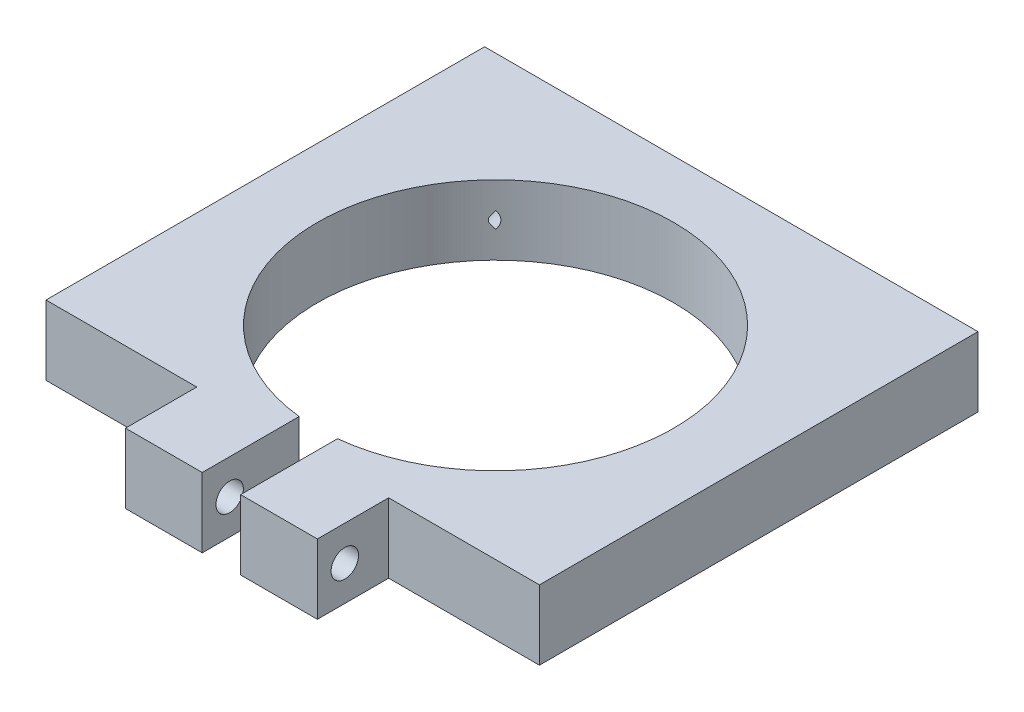
ISO-10303-21;
HEADER;
FILE_DESCRIPTION(('STEP AP214'),'2;1');
FILE_NAME('part.step','',(''),(''),'','','');
FILE_SCHEMA(('AUTOMOTIVE_DESIGN { 1 0 10303 214 1 1 1 1 }'));
ENDSEC;
DATA;
#1=APPLICATION_CONTEXT('core data for automotive mechanical design processes');
#2=APPLICATION_PROTOCOL_DEFINITION('international standard','automotive_design',2000,#1);
#3=PRODUCT_CONTEXT('',#1,'mechanical');
#4=PRODUCT('Part','Part','',(#3));
#5=PRODUCT_RELATED_PRODUCT_CATEGORY('part','',(#4));
#6=PRODUCT_DEFINITION_FORMATION('','',#4);
#7=PRODUCT_DEFINITION_CONTEXT('part definition',#1,'design');
#8=PRODUCT_DEFINITION('design','',#6,#7);
#9=PRODUCT_DEFINITION_SHAPE('','',#8);
#10=(LENGTH_UNIT() NAMED_UNIT(*) SI_UNIT(.MILLI.,.METRE.));
#11=(NAMED_UNIT(*) PLANE_ANGLE_UNIT() SI_UNIT($,.RADIAN.));
#12=(NAMED_UNIT(*) SI_UNIT($,.STERADIAN.) SOLID_ANGLE_UNIT());
#13=UNCERTAINTY_MEASURE_WITH_UNIT(LENGTH_MEASURE(1.E-05),#10,'distance_accuracy_value','');
#14=(GEOMETRIC_REPRESENTATION_CONTEXT(3) GLOBAL_UNCERTAINTY_ASSIGNED_CONTEXT((#13)) GLOBAL_UNIT_ASSIGNED_CONTEXT((#10,
#11,#12)) REPRESENTATION_CONTEXT('',''));
#15=CARTESIAN_POINT('',(0.,0.,0.));
#16=DIRECTION('',(0.,0.,1.));
#17=DIRECTION('',(1.,0.,0.));
#18=AXIS2_PLACEMENT_3D('',#15,#16,#17);
#19=CARTESIAN_POINT('',(-45.,12.7,46.5));
#20=DIRECTION('',(0.,0.,-1.));
#21=DIRECTION('',(-1.,0.,0.));
#22=AXIS2_PLACEMENT_3D('',#19,#20,#21);
#23=PLANE('',#22);
#24=DIRECTION('',(1.,0.,0.));
#25=VECTOR('',#24,1.);
#26=CARTESIAN_POINT('',(-45.,12.7,46.5));
#27=LINE('',#26,#25);
#28=CARTESIAN_POINT('',(3.50000000000001,12.7,46.5));
#29=VERTEX_POINT('',#28);
#30=CARTESIAN_POINT('',(17.5,12.7,46.5));
#31=VERTEX_POINT('',#30);
#32=EDGE_CURVE('E258',#29,#31,#27,.T.);
#33=ORIENTED_EDGE('',*,*,#32,.F.);
#34=DIRECTION('',(0.,1.,0.));
#35=VECTOR('',#34,1.);
#36=CARTESIAN_POINT('',(3.50000000000001,-0.000999999999999265,46.5));
#37=LINE('',#36,#35);
#38=CARTESIAN_POINT('',(3.50000000000001,0.,46.5));
#39=VERTEX_POINT('',#38);
#40=EDGE_CURVE('E200',#39,#29,#37,.T.);
#41=ORIENTED_EDGE('',*,*,#40,.F.);
#42=DIRECTION('',(1.,0.,0.));
#43=VECTOR('',#42,1.);
#44=CARTESIAN_POINT('',(-45.,0.,46.5));
#45=LINE('',#44,#43);
#46=CARTESIAN_POINT('',(17.5,0.,46.5));
#47=VERTEX_POINT('',#46);
#48=EDGE_CURVE('E271',#39,#47,#45,.T.);
#49=ORIENTED_EDGE('',*,*,#48,.T.);
#50=DIRECTION('',(0.,1.,0.));
#51=VECTOR('',#50,1.);
#52=CARTESIAN_POINT('',(17.5,-0.000999999999999265,46.5));
#53=LINE('',#52,#51);
#54=EDGE_CURVE('E235',#47,#31,#53,.T.);
#55=ORIENTED_EDGE('',*,*,#54,.T.);
#56=EDGE_LOOP('',(#33,#41,#49,#55));
#57=FACE_BOUND('',#56,.T.);
#58=ADVANCED_FACE('F33',(#57),#23,.F.);
#59=CARTESIAN_POINT('',(-45.,12.7,-46.5));
#60=DIRECTION('',(0.,0.,-1.));
#61=DIRECTION('',(-1.,0.,0.));
#62=AXIS2_PLACEMENT_3D('',#59,#60,#61);
#63=PLANE('',#62);
#64=CARTESIAN_POINT('',(40.,6.35,-46.5));
#65=DIRECTION('',(0.,0.,-1.));
#66=DIRECTION('',(-1.,0.,0.));
#67=AXIS2_PLACEMENT_3D('',#64,#65,#66);
#68=CIRCLE('',#67,2.5);
#69=CARTESIAN_POINT('',(37.5,6.35,-46.5));
#70=VERTEX_POINT('',#69);
#71=EDGE_CURVE('E160',#70,#70,#68,.T.);
#72=ORIENTED_EDGE('',*,*,#71,.F.);
#73=EDGE_LOOP('',(#72));
#74=FACE_BOUND('',#73,.T.);
#75=CARTESIAN_POINT('',(25.,6.35,-46.5));
#76=DIRECTION('',(0.,0.,-1.));
#77=DIRECTION('',(-1.,0.,0.));
#78=AXIS2_PLACEMENT_3D('',#75,#76,#77);
#79=CIRCLE('',#78,2.5);
#80=CARTESIAN_POINT('',(22.5,6.35,-46.5));
#81=VERTEX_POINT('',#80);
#82=EDGE_CURVE('E159',#81,#81,#79,.T.);
#83=ORIENTED_EDGE('',*,*,#82,.F.);
#84=EDGE_LOOP('',(#83));
#85=FACE_BOUND('',#84,.T.);
#86=CARTESIAN_POINT('',(-40.,6.35000000000001,-46.5));
#87=DIRECTION('',(0.,0.,-1.));
#88=DIRECTION('',(-1.,0.,0.));
#89=AXIS2_PLACEMENT_3D('',#86,#87,#88);
#90=CIRCLE('',#89,2.5);
#91=CARTESIAN_POINT('',(-42.5,6.35000000000001,-46.5));
#92=VERTEX_POINT('',#91);
#93=EDGE_CURVE('E168',#92,#92,#90,.T.);
#94=ORIENTED_EDGE('',*,*,#93,.F.);
#95=EDGE_LOOP('',(#94));
#96=FACE_BOUND('',#95,.T.);
#97=CARTESIAN_POINT('',(-25.,6.35000000000001,-46.5));
#98=DIRECTION('',(0.,0.,-1.));
#99=DIRECTION('',(-1.,0.,0.));
#100=AXIS2_PLACEMENT_3D('',#97,#98,#99);
#101=CIRCLE('',#100,2.5);
#102=CARTESIAN_POINT('',(-27.5,6.35000000000001,-46.5));
#103=VERTEX_POINT('',#102);
#104=EDGE_CURVE('E174',#103,#103,#101,.T.);
#105=ORIENTED_EDGE('',*,*,#104,.F.);
#106=EDGE_LOOP('',(#105));
#107=FACE_BOUND('',#106,.T.);
#108=DIRECTION('',(1.,0.,0.));
#109=VECTOR('',#108,1.);
#110=CARTESIAN_POINT('',(-45.,0.,-46.5));
#111=LINE('',#110,#109);
#112=CARTESIAN_POINT('',(-45.,0.,-46.5));
#113=VERTEX_POINT('',#112);
#114=CARTESIAN_POINT('',(45.,0.,-46.5));
#115=VERTEX_POINT('',#114);
#116=EDGE_CURVE('E248',#113,#115,#111,.T.);
#117=ORIENTED_EDGE('',*,*,#116,.F.);
#118=DIRECTION('',(0.,-1.,0.));
#119=VECTOR('',#118,1.);
#120=CARTESIAN_POINT('',(-45.,12.7,-46.5));
#121=LINE('',#120,#119);
#122=CARTESIAN_POINT('',(-45.,12.7,-46.5));
#123=VERTEX_POINT('',#122);
#124=EDGE_CURVE('E277',#123,#113,#121,.T.);
#125=ORIENTED_EDGE('',*,*,#124,.F.);
#126=DIRECTION('',(1.,0.,0.));
#127=VECTOR('',#126,1.);
#128=CARTESIAN_POINT('',(-45.,12.7,-46.5));
#129=LINE('',#128,#127);
#130=CARTESIAN_POINT('',(45.,12.7,-46.5));
#131=VERTEX_POINT('',#130);
#132=EDGE_CURVE('E251',#123,#131,#129,.T.);
#133=ORIENTED_EDGE('',*,*,#132,.T.);
#134=DIRECTION('',(0.,-1.,0.));
#135=VECTOR('',#134,1.);
#136=CARTESIAN_POINT('',(45.,12.7,-46.5));
#137=LINE('',#136,#135);
#138=EDGE_CURVE('E265',#131,#115,#137,.T.);
#139=ORIENTED_EDGE('',*,*,#138,.T.);
#140=EDGE_LOOP('',(#117,#125,#133,#139));
#141=FACE_BOUND('',#140,.T.);
#142=ADVANCED_FACE('F35',(#74,#85,#96,#107,#141),#63,.T.);
#143=CARTESIAN_POINT('',(-45.,12.7,-46.5));
#144=DIRECTION('',(1.,0.,0.));
#145=DIRECTION('',(0.,0.,-1.));
#146=AXIS2_PLACEMENT_3D('',#143,#144,#145);
#147=PLANE('',#146);
#148=DIRECTION('',(0.,0.,1.));
#149=VECTOR('',#148,1.);
#150=CARTESIAN_POINT('',(-45.,0.,-46.5));
#151=LINE('',#150,#149);
#152=CARTESIAN_POINT('',(-45.,0.,33.5));
#153=VERTEX_POINT('',#152);
#154=EDGE_CURVE('E255',#113,#153,#151,.T.);
#155=ORIENTED_EDGE('',*,*,#154,.T.);
#156=DIRECTION('',(0.,1.,0.));
#157=VECTOR('',#156,1.);
#158=CARTESIAN_POINT('',(-45.,-0.000999999999999265,33.5));
#159=LINE('',#158,#157);
#160=CARTESIAN_POINT('',(-45.,12.7,33.5));
#161=VERTEX_POINT('',#160);
#162=EDGE_CURVE('E219',#153,#161,#159,.T.);
#163=ORIENTED_EDGE('',*,*,#162,.T.);
#164=DIRECTION('',(0.,0.,1.));
#165=VECTOR('',#164,1.);
#166=CARTESIAN_POINT('',(-45.,12.7,-46.5));
#167=LINE('',#166,#165);
#168=EDGE_CURVE('E262',#123,#161,#167,.T.);
#169=ORIENTED_EDGE('',*,*,#168,.F.);
#170=ORIENTED_EDGE('',*,*,#124,.T.);
#171=EDGE_LOOP('',(#155,#163,#169,#170));
#172=FACE_BOUND('',#171,.T.);
#173=ADVANCED_FACE('F343',(#172),#147,.F.);
#174=CARTESIAN_POINT('',(-17.5,0.,46.5));
#175=VERTEX_POINT('',#174);
#176=CARTESIAN_POINT('',(-3.49999999999999,0.,46.5));
#177=VERTEX_POINT('',#176);
#178=EDGE_CURVE('E272',#175,#177,#45,.T.);
#179=ORIENTED_EDGE('',*,*,#178,.T.);
#180=DIRECTION('',(0.,1.,0.));
#181=VECTOR('',#180,1.);
#182=CARTESIAN_POINT('',(-3.49999999999999,-0.000999999999999265,46.5));
#183=LINE('',#182,#181);
#184=CARTESIAN_POINT('',(-3.49999999999999,12.7,46.5));
#185=VERTEX_POINT('',#184);
#186=EDGE_CURVE('E199',#177,#185,#183,.T.);
#187=ORIENTED_EDGE('',*,*,#186,.T.);
#188=CARTESIAN_POINT('',(-17.5,12.7,46.5));
#189=VERTEX_POINT('',#188);
#190=EDGE_CURVE('E259',#189,#185,#27,.T.);
#191=ORIENTED_EDGE('',*,*,#190,.F.);
#192=DIRECTION('',(0.,1.,0.));
#193=VECTOR('',#192,1.);
#194=CARTESIAN_POINT('',(-17.5,-0.000999999999999265,46.5));
#195=LINE('',#194,#193);
#196=EDGE_CURVE('E218',#175,#189,#195,.T.);
#197=ORIENTED_EDGE('',*,*,#196,.F.);
#198=EDGE_LOOP('',(#179,#187,#191,#197));
#199=FACE_BOUND('',#198,.T.);
#200=ADVANCED_FACE('F339',(#199),#23,.F.);
#201=CARTESIAN_POINT('',(45.,12.7,-46.5));
#202=DIRECTION('',(1.,0.,0.));
#203=DIRECTION('',(0.,0.,-1.));
#204=AXIS2_PLACEMENT_3D('',#201,#202,#203);
#205=PLANE('',#204);
#206=DIRECTION('',(0.,1.,0.));
#207=VECTOR('',#206,1.);
#208=CARTESIAN_POINT('',(45.,-0.000999999999999265,33.5));
#209=LINE('',#208,#207);
#210=CARTESIAN_POINT('',(45.,0.,33.5));
#211=VERTEX_POINT('',#210);
#212=CARTESIAN_POINT('',(45.,12.7,33.5));
#213=VERTEX_POINT('',#212);
#214=EDGE_CURVE('E234',#211,#213,#209,.T.);
#215=ORIENTED_EDGE('',*,*,#214,.F.);
#216=DIRECTION('',(0.,0.,1.));
#217=VECTOR('',#216,1.);
#218=CARTESIAN_POINT('',(45.,0.,-46.5));
#219=LINE('',#218,#217);
#220=EDGE_CURVE('E268',#115,#211,#219,.T.);
#221=ORIENTED_EDGE('',*,*,#220,.F.);
#222=ORIENTED_EDGE('',*,*,#138,.F.);
#223=DIRECTION('',(0.,0.,1.));
#224=VECTOR('',#223,1.);
#225=CARTESIAN_POINT('',(45.,12.7,-46.5));
#226=LINE('',#225,#224);
#227=EDGE_CURVE('E254',#131,#213,#226,.T.);
#228=ORIENTED_EDGE('',*,*,#227,.T.);
#229=EDGE_LOOP('',(#215,#221,#222,#228));
#230=FACE_BOUND('',#229,.T.);
#231=ADVANCED_FACE('F348',(#230),#205,.T.);
#232=CARTESIAN_POINT('',(45.,12.7,-46.5));
#233=DIRECTION('',(0.,-1.,0.));
#234=DIRECTION('',(0.,0.,-1.));
#235=AXIS2_PLACEMENT_3D('',#232,#233,#234);
#236=PLANE('',#235);
#237=CARTESIAN_POINT('',(0.,12.7,-3.5));
#238=DIRECTION('',(0.,1.,0.));
#239=DIRECTION('',(0.,0.,1.));
#240=AXIS2_PLACEMENT_3D('',#237,#238,#239);
#241=CIRCLE('',#240,32.51);
#242=CARTESIAN_POINT('',(3.50000000000001,12.7,28.8210473221398));
#243=VERTEX_POINT('',#242);
#244=CARTESIAN_POINT('',(-3.49999999999999,12.7,28.8210473221398));
#245=VERTEX_POINT('',#244);
#246=EDGE_CURVE('E244',#243,#245,#241,.T.);
#247=ORIENTED_EDGE('',*,*,#246,.F.);
#248=DIRECTION('',(0.,0.,-1.));
#249=VECTOR('',#248,1.);
#250=CARTESIAN_POINT('',(3.50000000000001,12.7,46.5));
#251=LINE('',#250,#249);
#252=EDGE_CURVE('E195',#29,#243,#251,.T.);
#253=ORIENTED_EDGE('',*,*,#252,.F.);
#254=ORIENTED_EDGE('',*,*,#32,.T.);
#255=DIRECTION('',(0.,0.,1.));
#256=VECTOR('',#255,1.);
#257=CARTESIAN_POINT('',(17.5,12.7,46.5));
#258=LINE('',#257,#256);
#259=CARTESIAN_POINT('',(17.5,12.7,33.5));
#260=VERTEX_POINT('',#259);
#261=EDGE_CURVE('E231',#260,#31,#258,.T.);
#262=ORIENTED_EDGE('',*,*,#261,.F.);
#263=DIRECTION('',(-1.,0.,0.));
#264=VECTOR('',#263,1.);
#265=CARTESIAN_POINT('',(45.,12.7,33.5));
#266=LINE('',#265,#264);
#267=EDGE_CURVE('E228',#213,#260,#266,.T.);
#268=ORIENTED_EDGE('',*,*,#267,.F.);
#269=ORIENTED_EDGE('',*,*,#227,.F.);
#270=ORIENTED_EDGE('',*,*,#132,.F.);
#271=ORIENTED_EDGE('',*,*,#168,.T.);
#272=DIRECTION('',(-1.,0.,0.));
#273=VECTOR('',#272,1.);
#274=CARTESIAN_POINT('',(-45.,12.7,33.5));
#275=LINE('',#274,#273);
#276=CARTESIAN_POINT('',(-17.5,12.7,33.5));
#277=VERTEX_POINT('',#276);
#278=EDGE_CURVE('E216',#277,#161,#275,.T.);
#279=ORIENTED_EDGE('',*,*,#278,.F.);
#280=DIRECTION('',(0.,0.,-1.));
#281=VECTOR('',#280,1.);
#282=CARTESIAN_POINT('',(-17.5,12.7,46.5));
#283=LINE('',#282,#281);
#284=EDGE_CURVE('E213',#189,#277,#283,.T.);
#285=ORIENTED_EDGE('',*,*,#284,.F.);
#286=ORIENTED_EDGE('',*,*,#190,.T.);
#287=DIRECTION('',(0.,0.,1.));
#288=VECTOR('',#287,1.);
#289=CARTESIAN_POINT('',(-3.49999999999999,12.7,46.5));
#290=LINE('',#289,#288);
#291=EDGE_CURVE('E197',#245,#185,#290,.T.);
#292=ORIENTED_EDGE('',*,*,#291,.F.);
#293=EDGE_LOOP('',(#247,#253,#254,#262,#268,#269,#270,#271,#279,#285,#286,#292));
#294=FACE_BOUND('',#293,.T.);
#295=ADVANCED_FACE('F354',(#294),#236,.F.);
#296=CARTESIAN_POINT('',(45.,0.,-46.5));
#297=DIRECTION('',(0.,-1.,0.));
#298=DIRECTION('',(0.,0.,-1.));
#299=AXIS2_PLACEMENT_3D('',#296,#297,#298);
#300=PLANE('',#299);
#301=DIRECTION('',(0.,0.,-1.));
#302=VECTOR('',#301,1.);
#303=CARTESIAN_POINT('',(3.50000000000001,0.,46.5));
#304=LINE('',#303,#302);
#305=CARTESIAN_POINT('',(3.50000000000001,0.,28.8210473221398));
#306=VERTEX_POINT('',#305);
#307=EDGE_CURVE('E192',#39,#306,#304,.T.);
#308=ORIENTED_EDGE('',*,*,#307,.T.);
#309=CARTESIAN_POINT('',(0.,0.,-3.5));
#310=DIRECTION('',(0.,1.,0.));
#311=DIRECTION('',(0.,0.,1.));
#312=AXIS2_PLACEMENT_3D('',#309,#310,#311);
#313=CIRCLE('',#312,32.51);
#314=CARTESIAN_POINT('',(-3.49999999999999,0.,28.8210473221398));
#315=VERTEX_POINT('',#314);
#316=EDGE_CURVE('E245',#306,#315,#313,.T.);
#317=ORIENTED_EDGE('',*,*,#316,.T.);
#318=DIRECTION('',(0.,0.,1.));
#319=VECTOR('',#318,1.);
#320=CARTESIAN_POINT('',(-3.49999999999999,0.,46.5));
#321=LINE('',#320,#319);
#322=EDGE_CURVE('E202',#315,#177,#321,.T.);
#323=ORIENTED_EDGE('',*,*,#322,.T.);
#324=ORIENTED_EDGE('',*,*,#178,.F.);
#325=DIRECTION('',(0.,0.,-1.));
#326=VECTOR('',#325,1.);
#327=CARTESIAN_POINT('',(-17.5,0.,46.5));
#328=LINE('',#327,#326);
#329=CARTESIAN_POINT('',(-17.5,0.,33.5));
#330=VERTEX_POINT('',#329);
#331=EDGE_CURVE('E207',#175,#330,#328,.T.);
#332=ORIENTED_EDGE('',*,*,#331,.T.);
#333=DIRECTION('',(-1.,0.,0.));
#334=VECTOR('',#333,1.);
#335=CARTESIAN_POINT('',(-45.,0.,33.5));
#336=LINE('',#335,#334);
#337=EDGE_CURVE('E210',#330,#153,#336,.T.);
#338=ORIENTED_EDGE('',*,*,#337,.T.);
#339=ORIENTED_EDGE('',*,*,#154,.F.);
#340=ORIENTED_EDGE('',*,*,#116,.T.);
#341=ORIENTED_EDGE('',*,*,#220,.T.);
#342=DIRECTION('',(-1.,0.,0.));
#343=VECTOR('',#342,1.);
#344=CARTESIAN_POINT('',(45.,0.,33.5));
#345=LINE('',#344,#343);
#346=CARTESIAN_POINT('',(17.5,0.,33.5));
#347=VERTEX_POINT('',#346);
#348=EDGE_CURVE('E238',#211,#347,#345,.T.);
#349=ORIENTED_EDGE('',*,*,#348,.T.);
#350=DIRECTION('',(0.,0.,1.));
#351=VECTOR('',#350,1.);
#352=CARTESIAN_POINT('',(17.5,0.,46.5));
#353=LINE('',#352,#351);
#354=EDGE_CURVE('E222',#347,#47,#353,.T.);
#355=ORIENTED_EDGE('',*,*,#354,.T.);
#356=ORIENTED_EDGE('',*,*,#48,.F.);
#357=EDGE_LOOP('',(#308,#317,#323,#324,#332,#338,#339,#340,#341,#349,#355,#356));
#358=FACE_BOUND('',#357,.T.);
#359=ADVANCED_FACE('F361',(#358),#300,.T.);
#360=CARTESIAN_POINT('',(0.,0.,-3.5));
#361=DIRECTION('',(0.,1.,0.));
#362=DIRECTION('',(0.,0.,1.));
#363=AXIS2_PLACEMENT_3D('',#360,#361,#362);
#364=CYLINDRICAL_SURFACE('',#363,32.51);
#365=CARTESIAN_POINT('',(22.8245126599102,8.03273160406904,-26.6504151547569));
#366=CARTESIAN_POINT('',(22.8578856965579,7.98636449310996,-26.6175123290705));
#367=CARTESIAN_POINT('',(22.891008675288,7.93974203354632,-26.5847129246827));
#368=CARTESIAN_POINT('',(22.9566891760717,7.84588563691829,-26.519397540114));
#369=CARTESIAN_POINT('',(22.9892465809804,7.79865157662992,-26.4868816193284));
#370=CARTESIAN_POINT('',(23.0537943288036,7.70337577493946,-26.4221456388135));
#371=CARTESIAN_POINT('',(23.0857831211278,7.65533236547621,-26.3899264777613));
#372=CARTESIAN_POINT('',(23.1489844194344,7.55840735884757,-26.3260080579623));
#373=CARTESIAN_POINT('',(23.1801969940413,7.50952583642899,-26.2943087533405));
#374=CARTESIAN_POINT('',(23.2590788967889,7.382789437945,-26.2138735163471));
#375=CARTESIAN_POINT('',(23.3060741730503,7.30418038549304,-26.1656393702641));
#376=CARTESIAN_POINT('',(23.3738683234472,7.18331859036884,-26.0956509908601));
#377=CARTESIAN_POINT('',(23.3960253185399,7.14252219981247,-26.0727061971481));
#378=CARTESIAN_POINT('',(23.4390981071229,7.05966424275348,-26.0279768765211));
#379=CARTESIAN_POINT('',(23.4600142197385,7.01760300576876,-26.0061920514391));
#380=CARTESIAN_POINT('',(23.5059670693648,6.91935791909232,-25.9582057407222));
#381=CARTESIAN_POINT('',(23.5304325929671,6.86262504219482,-25.93256286246));
#382=CARTESIAN_POINT('',(23.5745751364237,6.74534391453878,-25.8861681196865));
#383=CARTESIAN_POINT('',(23.5942625378758,6.68480430206191,-25.8654056544754));
#384=CARTESIAN_POINT('',(23.6199923856961,6.58064178994387,-25.8382248639014));
#385=CARTESIAN_POINT('',(23.6283985402674,6.53829551996295,-25.8293294257176));
#386=CARTESIAN_POINT('',(23.6402392454988,6.45223132946878,-25.8167933840262));
#387=CARTESIAN_POINT('',(23.6436921342987,6.40851908379417,-25.8131333978038));
#388=CARTESIAN_POINT('',(23.6449374529276,6.32069789811384,-25.8118137928911));
#389=CARTESIAN_POINT('',(23.6427023436774,6.27658806238417,-25.8141833669864));
#390=CARTESIAN_POINT('',(23.633004266395,6.18955263399944,-25.8244542073858));
#391=CARTESIAN_POINT('',(23.6255253722807,6.14663106414846,-25.8323723253238));
#392=CARTESIAN_POINT('',(23.600639624617,6.03608351577937,-25.85867597429));
#393=CARTESIAN_POINT('',(23.5799442311175,5.97007471114548,-25.8805154938971));
#394=CARTESIAN_POINT('',(23.5445138541337,5.87433765582256,-25.9177669864368));
#395=CARTESIAN_POINT('',(23.5318910852058,5.84280779682581,-25.9310180168143));
#396=CARTESIAN_POINT('',(23.50552250207,5.78072629625319,-25.9586480884082));
#397=CARTESIAN_POINT('',(23.4917771682375,5.7501742439576,-25.9730266470212));
#398=CARTESIAN_POINT('',(23.4540029784296,5.66979475852147,-26.0124633509558));
#399=CARTESIAN_POINT('',(23.4292244389558,5.62068765144205,-26.0382539589711));
#400=CARTESIAN_POINT('',(23.378081630857,5.52410698990929,-26.0912984265672));
#401=CARTESIAN_POINT('',(23.3517166944214,5.47663413682066,-26.1185529018527));
#402=CARTESIAN_POINT('',(23.2708227252097,5.33584904990829,-26.2018696164429));
#403=CARTESIAN_POINT('',(23.2145973332559,5.24437569355004,-26.2593775980994));
#404=CARTESIAN_POINT('',(23.1034632485375,5.07083572225966,-26.3721651358271));
#405=CARTESIAN_POINT('',(23.04874189283,4.98856095318612,-26.4273153351782));
#406=CARTESIAN_POINT('',(22.9654316267715,4.86681135405185,-26.5106623909107));
#407=CARTESIAN_POINT('',(22.937528648249,4.8266044498359,-26.5384775308314));
#408=CARTESIAN_POINT('',(22.8813160484351,4.74662492110061,-26.5943076730212));
#409=CARTESIAN_POINT('',(22.8530064745531,4.70685224688628,-26.6223226518002));
#410=CARTESIAN_POINT('',(22.824512659912,4.66726839592857,-26.6504151547554));
#411=B_SPLINE_CURVE_WITH_KNOTS('',3,(#365,#366,#367,#368,#369,#370,#371,#372,#373,#374,#375,
#376,#377,#378,#379,#380,#381,#382,#383,#384,#385,#386,#387,#388,#389,#390,#391,#392,#393,#394,
#395,#396,#397,#398,#399,#400,#401,#402,#403,#404,#405,#406,#407,#408,#409,#410),.UNSPECIFIED.,
.F.,.F.,(4,2,2,2,2,2,2,2,2,2,2,2,2,2,2,2,2,2,2,2,2,2,4),(0.,0.197779374062787,0.395599236268489,
0.593894443323957,0.79217205653909,1.10256375846405,1.25789014921333,1.4131764190265,
1.61363397559775,1.81365201140078,1.94541778253308,2.07669445592724,2.20860792799752,
2.34092378435056,2.55724876985542,2.66661614841213,2.77593696853813,2.95809700104627,
3.14033425963447,3.5055679928483,3.84501355391799,4.01388770531375,4.18274232311147),.UNSPECIFIED.);
#412=CARTESIAN_POINT('',(22.9760766885907,7.81756070727378,-26.5));
#413=VERTEX_POINT('',#412);
#414=CARTESIAN_POINT('',(22.9760766885914,4.8824392927263,-26.4999999999994));
#415=VERTEX_POINT('',#414);
#416=EDGE_CURVE('E46',#413,#415,#411,.T.);
#417=ORIENTED_EDGE('',*,*,#416,.T.);
#418=CARTESIAN_POINT('',(22.9760766885907,4.88243929272623,-26.5));
#419=CARTESIAN_POINT('',(22.945514434068,4.92459328627809,-26.5305310471415));
#420=CARTESIAN_POINT('',(22.9159025029324,4.96819945693463,-26.5599897842512));
#421=CARTESIAN_POINT('',(22.8588563247327,5.05835014076838,-26.6165394731979));
#422=CARTESIAN_POINT('',(22.8314242528938,5.10489750778826,-26.6436280625835));
#423=CARTESIAN_POINT('',(22.7525581731281,5.249504382547,-26.7212543538606));
#424=CARTESIAN_POINT('',(22.7049648096278,5.35197390270439,-26.7677438932206));
#425=CARTESIAN_POINT('',(22.6227620718382,5.56761482671347,-26.8476781930616));
#426=CARTESIAN_POINT('',(22.5882313826983,5.68084610094242,-26.8810439466682));
#427=CARTESIAN_POINT('',(22.5354072432105,5.91411985514963,-26.9319631870418));
#428=CARTESIAN_POINT('',(22.517054873915,6.03413591167557,-26.949574054183));
#429=CARTESIAN_POINT('',(22.4991453082455,6.26348061304514,-26.966757064898));
#430=CARTESIAN_POINT('',(22.4977466458129,6.37253686409296,-26.9680965956538));
#431=CARTESIAN_POINT('',(22.5091114840635,6.58925362646505,-26.957196386427));
#432=CARTESIAN_POINT('',(22.5218788034205,6.69691375352471,-26.9449529849413));
#433=CARTESIAN_POINT('',(22.5594299695076,6.90114805479923,-26.908819592752));
#434=CARTESIAN_POINT('',(22.5834476796913,6.99799991995029,-26.885671682314));
#435=CARTESIAN_POINT('',(22.6417197685429,7.18556811976714,-26.8292577228296));
#436=CARTESIAN_POINT('',(22.6759869852086,7.27627658374052,-26.7959789834997));
#437=CARTESIAN_POINT('',(22.7513866028538,7.44637099299945,-26.7223414520289));
#438=CARTESIAN_POINT('',(22.7921661953777,7.52607398575164,-26.6823428033375));
#439=CARTESIAN_POINT('',(22.8798680747625,7.67766573761631,-26.595791182659));
#440=CARTESIAN_POINT('',(22.926762931203,7.74958691255873,-26.5492674130405));
#441=CARTESIAN_POINT('',(22.9760766885907,7.81756070727378,-26.5));
#442=B_SPLINE_CURVE_WITH_KNOTS('',3,(#418,#419,#420,#421,#422,#423,#424,#425,#426,#427,#428,
#429,#430,#431,#432,#433,#434,#435,#436,#437,#438,#439,#440,#441),.UNSPECIFIED.,.F.,.F.,(4,2,2,
2,2,2,2,2,2,2,2,4),(0.,0.181011106495342,0.362200628429952,0.726961895857972,1.09388664122208,
1.45946951601222,1.78493582808804,2.11048989628926,2.41653036358971,2.72295577802283,
3.0163849789454,3.30854056078505),.UNSPECIFIED.);
#443=EDGE_CURVE('E11',#415,#413,#442,.T.);
#444=ORIENTED_EDGE('',*,*,#443,.T.);
#445=EDGE_LOOP('',(#417,#444));
#446=FACE_BOUND('',#445,.T.);
#447=CARTESIAN_POINT('',(-22.8245126599099,4.66726839593048,-26.6504151547572));
#448=CARTESIAN_POINT('',(-22.8578856965575,4.71363550688955,-26.6175123290708));
#449=CARTESIAN_POINT('',(-22.8910086752876,4.76025796645317,-26.5847129246831));
#450=CARTESIAN_POINT('',(-22.9566891760713,4.85411436308117,-26.5193975401144));
#451=CARTESIAN_POINT('',(-22.98924658098,4.90134842336952,-26.4868816193288));
#452=CARTESIAN_POINT('',(-23.0537943288032,4.99662422505995,-26.4221456388139));
#453=CARTESIAN_POINT('',(-23.0857831211274,5.04466763452318,-26.3899264777617));
#454=CARTESIAN_POINT('',(-23.1489844194339,5.14159264115178,-26.3260080579628));
#455=CARTESIAN_POINT('',(-23.1801969940408,5.19047416357033,-26.294308753341));
#456=CARTESIAN_POINT('',(-23.2590788967884,5.31721056205412,-26.2138735163476));
#457=CARTESIAN_POINT('',(-23.3060741730497,5.39581961450592,-26.1656393702647));
#458=CARTESIAN_POINT('',(-23.3738683234465,5.51668140962984,-26.0956509908609));
#459=CARTESIAN_POINT('',(-23.3960253185391,5.55747780018611,-26.0727061971489));
#460=CARTESIAN_POINT('',(-23.4390981071221,5.6403357572449,-26.027976876522));
#461=CARTESIAN_POINT('',(-23.4600142197376,5.68239699422952,-26.00619205144));
#462=CARTESIAN_POINT('',(-23.5059670693642,5.78064208090614,-25.9582057407229));
#463=CARTESIAN_POINT('',(-23.5304325929666,5.83737495780395,-25.9325628624605));
#464=CARTESIAN_POINT('',(-23.5745751364235,5.95465608546062,-25.8861681196867));
#465=CARTESIAN_POINT('',(-23.5942625378757,6.01519569793783,-25.8654056544754));
#466=CARTESIAN_POINT('',(-23.6199923856961,6.11935821005623,-25.8382248639014));
#467=CARTESIAN_POINT('',(-23.6283985402674,6.16170448003715,-25.8293294257176));
#468=CARTESIAN_POINT('',(-23.6402392454988,6.24776867053132,-25.8167933840262));
#469=CARTESIAN_POINT('',(-23.6436921342986,6.29148091620593,-25.8131333978038));
#470=CARTESIAN_POINT('',(-23.6449374529276,6.37930210188627,-25.8118137928911));
#471=CARTESIAN_POINT('',(-23.6427023436774,6.42341193761593,-25.8141833669864));
#472=CARTESIAN_POINT('',(-23.633004266395,6.51044736600066,-25.8244542073858));
#473=CARTESIAN_POINT('',(-23.6255253722807,6.55336893585164,-25.8323723253238));
#474=CARTESIAN_POINT('',(-23.6006396246169,6.66391648422074,-25.8586759742901));
#475=CARTESIAN_POINT('',(-23.5799442311175,6.72992528885464,-25.8805154938972));
#476=CARTESIAN_POINT('',(-23.5445138541337,6.82566234417757,-25.9177669864368));
#477=CARTESIAN_POINT('',(-23.5318910852058,6.85719220317433,-25.9310180168144));
#478=CARTESIAN_POINT('',(-23.5055225020699,6.91927370374697,-25.9586480884082));
#479=CARTESIAN_POINT('',(-23.4917771682375,6.94982575604257,-25.9730266470213));
#480=CARTESIAN_POINT('',(-23.4540029784295,7.03020524147867,-26.0124633509559));
#481=CARTESIAN_POINT('',(-23.4292244389557,7.07931234855806,-26.0382539589712));
#482=CARTESIAN_POINT('',(-23.378081630857,7.17589301009076,-26.0912984265672));
#483=CARTESIAN_POINT('',(-23.3517166944214,7.22336586317935,-26.1185529018527));
#484=CARTESIAN_POINT('',(-23.2708227252097,7.36415095009164,-26.2018696164429));
#485=CARTESIAN_POINT('',(-23.214597333256,7.45562430644984,-26.2593775980993));
#486=CARTESIAN_POINT('',(-23.1034632485376,7.62916427774011,-26.372165135827));
#487=CARTESIAN_POINT('',(-23.0487418928301,7.71143904681358,-26.427315335178));
#488=CARTESIAN_POINT('',(-22.9654316267717,7.83318864594779,-26.5106623909104));
#489=CARTESIAN_POINT('',(-22.9375286482493,7.87339555016372,-26.5384775308312));
#490=CARTESIAN_POINT('',(-22.8813160484354,7.95337507889897,-26.5943076730209));
#491=CARTESIAN_POINT('',(-22.8530064745535,7.99314775311327,-26.6223226517998));
#492=CARTESIAN_POINT('',(-22.8245126599124,8.03273160407095,-26.6504151547551));
#493=B_SPLINE_CURVE_WITH_KNOTS('',3,(#447,#448,#449,#450,#451,#452,#453,#454,#455,#456,#457,
#458,#459,#460,#461,#462,#463,#464,#465,#466,#467,#468,#469,#470,#471,#472,#473,#474,#475,#476,
#477,#478,#479,#480,#481,#482,#483,#484,#485,#486,#487,#488,#489,#490,#491,#492),.UNSPECIFIED.,
.F.,.F.,(4,2,2,2,2,2,2,2,2,2,2,2,2,2,2,2,2,2,2,2,2,2,4),(0.,0.197779374062736,0.395599236268388,
0.593894443323781,0.792172056538841,1.10256375846316,1.25789014921213,1.413176419025,
1.6136339755974,1.81365201140157,1.94541778253387,2.07669445592803,2.2086079279983,
2.34092378435134,2.55724876985626,2.66661614841299,2.77593696853902,2.95809700104705,
3.14033425963514,3.50556799284873,3.84501355391821,4.01388770531385,4.18274232311146),.UNSPECIFIED.);
#494=CARTESIAN_POINT('',(-22.9760766885907,4.88243929272624,-26.5));
#495=VERTEX_POINT('',#494);
#496=CARTESIAN_POINT('',(-22.9760766885914,7.81756070727371,-26.4999999999994));
#497=VERTEX_POINT('',#496);
#498=EDGE_CURVE('E279',#495,#497,#493,.T.);
#499=ORIENTED_EDGE('',*,*,#498,.T.);
#500=CARTESIAN_POINT('',(-22.9760766885907,7.81756070727379,-26.5));
#501=CARTESIAN_POINT('',(-22.945514434068,7.77540671372193,-26.5305310471415));
#502=CARTESIAN_POINT('',(-22.9159025029324,7.73180054306538,-26.5599897842512));
#503=CARTESIAN_POINT('',(-22.8588563247327,7.64164985923164,-26.6165394731979));
#504=CARTESIAN_POINT('',(-22.8314242528938,7.59510249221175,-26.6436280625835));
#505=CARTESIAN_POINT('',(-22.7525581731281,7.45049561745301,-26.7212543538606));
#506=CARTESIAN_POINT('',(-22.7049648096278,7.34802609729562,-26.7677438932206));
#507=CARTESIAN_POINT('',(-22.6227620718382,7.13238517328654,-26.8476781930616));
#508=CARTESIAN_POINT('',(-22.5882313826983,7.01915389905759,-26.8810439466682));
#509=CARTESIAN_POINT('',(-22.5354072432105,6.78588014485039,-26.9319631870418));
#510=CARTESIAN_POINT('',(-22.517054873915,6.66586408832445,-26.949574054183));
#511=CARTESIAN_POINT('',(-22.4991453082455,6.43651938695487,-26.966757064898));
#512=CARTESIAN_POINT('',(-22.4977466458129,6.32746313590705,-26.9680965956538));
#513=CARTESIAN_POINT('',(-22.5091114840635,6.11074637353496,-26.957196386427));
#514=CARTESIAN_POINT('',(-22.5218788034204,6.0030862464753,-26.9449529849413));
#515=CARTESIAN_POINT('',(-22.5594299695076,5.79885194520078,-26.908819592752));
#516=CARTESIAN_POINT('',(-22.5834476796913,5.70200008004972,-26.885671682314));
#517=CARTESIAN_POINT('',(-22.6417197685429,5.51443188023287,-26.8292577228296));
#518=CARTESIAN_POINT('',(-22.6759869852086,5.42372341625949,-26.7959789834997));
#519=CARTESIAN_POINT('',(-22.7513866028538,5.25362900700056,-26.7223414520289));
#520=CARTESIAN_POINT('',(-22.7921661953777,5.17392601424837,-26.6823428033375));
#521=CARTESIAN_POINT('',(-22.8798680747625,5.0223342623837,-26.595791182659));
#522=CARTESIAN_POINT('',(-22.926762931203,4.95041308744129,-26.5492674130405));
#523=CARTESIAN_POINT('',(-22.9760766885907,4.88243929272623,-26.5));
#524=B_SPLINE_CURVE_WITH_KNOTS('',3,(#500,#501,#502,#503,#504,#505,#506,#507,#508,#509,#510,
#511,#512,#513,#514,#515,#516,#517,#518,#519,#520,#521,#522,#523),.UNSPECIFIED.,.F.,.F.,(4,2,2,
2,2,2,2,2,2,2,2,4),(0.,0.181011106495342,0.362200628429952,0.726961895857973,1.09388664122208,
1.45946951601222,1.78493582808804,2.11048989628926,2.41653036358971,2.72295577802283,
3.0163849789454,3.30854056078505),.UNSPECIFIED.);
#525=EDGE_CURVE('E289',#497,#495,#524,.T.);
#526=ORIENTED_EDGE('',*,*,#525,.T.);
#527=EDGE_LOOP('',(#499,#526));
#528=FACE_BOUND('',#527,.T.);
#529=ORIENTED_EDGE('',*,*,#316,.F.);
#530=DIRECTION('',(0.,1.,0.));
#531=VECTOR('',#530,1.);
#532=CARTESIAN_POINT('',(3.50000000000001,0.,28.8210473221398));
#533=LINE('',#532,#531);
#534=EDGE_CURVE('E190',#243,#306,#533,.F.);
#535=ORIENTED_EDGE('',*,*,#534,.F.);
#536=ORIENTED_EDGE('',*,*,#246,.T.);
#537=DIRECTION('',(0.,1.,0.));
#538=VECTOR('',#537,1.);
#539=CARTESIAN_POINT('',(-3.49999999999999,0.,28.8210473221398));
#540=LINE('',#539,#538);
#541=EDGE_CURVE('E188',#315,#245,#540,.T.);
#542=ORIENTED_EDGE('',*,*,#541,.F.);
#543=EDGE_LOOP('',(#529,#535,#536,#542));
#544=FACE_BOUND('',#543,.T.);
#545=ADVANCED_FACE('F294',(#446,#528,#544),#364,.F.);
#546=CARTESIAN_POINT('',(17.5,-0.000999999999999265,46.5));
#547=DIRECTION('',(-1.,0.,0.));
#548=DIRECTION('',(0.,0.,1.));
#549=AXIS2_PLACEMENT_3D('',#546,#547,#548);
#550=PLANE('',#549);
#551=CARTESIAN_POINT('',(17.5,6.35,41.5));
#552=DIRECTION('',(-1.,0.,0.));
#553=DIRECTION('',(0.,0.,1.));
#554=AXIS2_PLACEMENT_3D('',#551,#552,#553);
#555=CIRCLE('',#554,2.5);
#556=CARTESIAN_POINT('',(17.5,6.35,44.));
#557=VERTEX_POINT('',#556);
#558=EDGE_CURVE('E181',#557,#557,#555,.F.);
#559=ORIENTED_EDGE('',*,*,#558,.F.);
#560=EDGE_LOOP('',(#559));
#561=FACE_BOUND('',#560,.T.);
#562=DIRECTION('',(0.,1.,0.));
#563=VECTOR('',#562,1.);
#564=CARTESIAN_POINT('',(17.5,-0.000999999999999265,33.5));
#565=LINE('',#564,#563);
#566=EDGE_CURVE('E239',#347,#260,#565,.T.);
#567=ORIENTED_EDGE('',*,*,#566,.T.);
#568=ORIENTED_EDGE('',*,*,#261,.T.);
#569=ORIENTED_EDGE('',*,*,#54,.F.);
#570=ORIENTED_EDGE('',*,*,#354,.F.);
#571=EDGE_LOOP('',(#567,#568,#569,#570));
#572=FACE_BOUND('',#571,.T.);
#573=ADVANCED_FACE('F329',(#561,#572),#550,.F.);
#574=CARTESIAN_POINT('',(45.,-0.000999999999999265,33.5));
#575=DIRECTION('',(0.,0.,-1.));
#576=DIRECTION('',(-1.,0.,0.));
#577=AXIS2_PLACEMENT_3D('',#574,#575,#576);
#578=PLANE('',#577);
#579=ORIENTED_EDGE('',*,*,#214,.T.);
#580=ORIENTED_EDGE('',*,*,#267,.T.);
#581=ORIENTED_EDGE('',*,*,#566,.F.);
#582=ORIENTED_EDGE('',*,*,#348,.F.);
#583=EDGE_LOOP('',(#579,#580,#581,#582));
#584=FACE_BOUND('',#583,.T.);
#585=ADVANCED_FACE('F324',(#584),#578,.F.);
#586=CARTESIAN_POINT('',(-45.,-0.000999999999999265,33.5));
#587=DIRECTION('',(0.,0.,-1.));
#588=DIRECTION('',(-1.,0.,0.));
#589=AXIS2_PLACEMENT_3D('',#586,#587,#588);
#590=PLANE('',#589);
#591=DIRECTION('',(0.,1.,0.));
#592=VECTOR('',#591,1.);
#593=CARTESIAN_POINT('',(-17.5,-0.000999999999999265,33.5));
#594=LINE('',#593,#592);
#595=EDGE_CURVE('E223',#330,#277,#594,.T.);
#596=ORIENTED_EDGE('',*,*,#595,.T.);
#597=ORIENTED_EDGE('',*,*,#278,.T.);
#598=ORIENTED_EDGE('',*,*,#162,.F.);
#599=ORIENTED_EDGE('',*,*,#337,.F.);
#600=EDGE_LOOP('',(#596,#597,#598,#599));
#601=FACE_BOUND('',#600,.T.);
#602=ADVANCED_FACE('F321',(#601),#590,.F.);
#603=CARTESIAN_POINT('',(-17.5,-0.000999999999999265,46.5));
#604=DIRECTION('',(1.,0.,0.));
#605=DIRECTION('',(0.,0.,-1.));
#606=AXIS2_PLACEMENT_3D('',#603,#604,#605);
#607=PLANE('',#606);
#608=CARTESIAN_POINT('',(-17.5,6.35,41.5));
#609=DIRECTION('',(-1.,0.,0.));
#610=DIRECTION('',(0.,0.,1.));
#611=AXIS2_PLACEMENT_3D('',#608,#609,#610);
#612=CIRCLE('',#611,2.5);
#613=CARTESIAN_POINT('',(-17.5,6.35,44.));
#614=VERTEX_POINT('',#613);
#615=EDGE_CURVE('E178',#614,#614,#612,.T.);
#616=ORIENTED_EDGE('',*,*,#615,.F.);
#617=EDGE_LOOP('',(#616));
#618=FACE_BOUND('',#617,.T.);
#619=ORIENTED_EDGE('',*,*,#196,.T.);
#620=ORIENTED_EDGE('',*,*,#284,.T.);
#621=ORIENTED_EDGE('',*,*,#595,.F.);
#622=ORIENTED_EDGE('',*,*,#331,.F.);
#623=EDGE_LOOP('',(#619,#620,#621,#622));
#624=FACE_BOUND('',#623,.T.);
#625=ADVANCED_FACE('F316',(#618,#624),#607,.F.);
#626=CARTESIAN_POINT('',(-3.49999999999999,-0.000999999999999265,46.5));
#627=DIRECTION('',(-1.,0.,0.));
#628=DIRECTION('',(0.,0.,1.));
#629=AXIS2_PLACEMENT_3D('',#626,#627,#628);
#630=PLANE('',#629);
#631=CARTESIAN_POINT('',(-3.49999999999999,6.35,41.5));
#632=DIRECTION('',(-1.,0.,0.));
#633=DIRECTION('',(0.,0.,1.));
#634=AXIS2_PLACEMENT_3D('',#631,#632,#633);
#635=CIRCLE('',#634,2.5);
#636=CARTESIAN_POINT('',(-3.49999999999999,6.35,44.));
#637=VERTEX_POINT('',#636);
#638=EDGE_CURVE('E185',#637,#637,#635,.T.);
#639=ORIENTED_EDGE('',*,*,#638,.T.);
#640=EDGE_LOOP('',(#639));
#641=FACE_BOUND('',#640,.T.);
#642=ORIENTED_EDGE('',*,*,#541,.T.);
#643=ORIENTED_EDGE('',*,*,#291,.T.);
#644=ORIENTED_EDGE('',*,*,#186,.F.);
#645=ORIENTED_EDGE('',*,*,#322,.F.);
#646=EDGE_LOOP('',(#642,#643,#644,#645));
#647=FACE_BOUND('',#646,.T.);
#648=ADVANCED_FACE('F312',(#641,#647),#630,.F.);
#649=CARTESIAN_POINT('',(3.50000000000001,-0.000999999999999265,46.5));
#650=DIRECTION('',(1.,0.,0.));
#651=DIRECTION('',(0.,0.,-1.));
#652=AXIS2_PLACEMENT_3D('',#649,#650,#651);
#653=PLANE('',#652);
#654=CARTESIAN_POINT('',(3.50000000000001,6.35,41.5));
#655=DIRECTION('',(1.,0.,0.));
#656=DIRECTION('',(0.,0.,-1.));
#657=AXIS2_PLACEMENT_3D('',#654,#655,#656);
#658=CIRCLE('',#657,2.5);
#659=CARTESIAN_POINT('',(3.50000000000001,6.35,39.));
#660=VERTEX_POINT('',#659);
#661=EDGE_CURVE('E184',#660,#660,#658,.T.);
#662=ORIENTED_EDGE('',*,*,#661,.T.);
#663=EDGE_LOOP('',(#662));
#664=FACE_BOUND('',#663,.T.);
#665=ORIENTED_EDGE('',*,*,#40,.T.);
#666=ORIENTED_EDGE('',*,*,#252,.T.);
#667=ORIENTED_EDGE('',*,*,#534,.T.);
#668=ORIENTED_EDGE('',*,*,#307,.F.);
#669=EDGE_LOOP('',(#665,#666,#667,#668));
#670=FACE_BOUND('',#669,.T.);
#671=ADVANCED_FACE('F315',(#664,#670),#653,.F.);
#672=CARTESIAN_POINT('',(24.5710678118655,6.35,41.5));
#673=DIRECTION('',(-1.,0.,0.));
#674=DIRECTION('',(0.,0.,1.));
#675=AXIS2_PLACEMENT_3D('',#672,#673,#674);
#676=CYLINDRICAL_SURFACE('',#675,2.5);
#677=ORIENTED_EDGE('',*,*,#558,.T.);
#678=EDGE_LOOP('',(#677));
#679=FACE_BOUND('',#678,.T.);
#680=ORIENTED_EDGE('',*,*,#661,.F.);
#681=EDGE_LOOP('',(#680));
#682=FACE_BOUND('',#681,.T.);
#683=ADVANCED_FACE('F310',(#679,#682),#676,.F.);
#684=ORIENTED_EDGE('',*,*,#615,.T.);
#685=EDGE_LOOP('',(#684));
#686=FACE_BOUND('',#685,.T.);
#687=ORIENTED_EDGE('',*,*,#638,.F.);
#688=EDGE_LOOP('',(#687));
#689=FACE_BOUND('',#688,.T.);
#690=ADVANCED_FACE('F307',(#686,#689),#676,.F.);
#691=CARTESIAN_POINT('',(-25.,6.35000000000001,-46.5));
#692=DIRECTION('',(0.,0.,-1.));
#693=DIRECTION('',(-1.,0.,0.));
#694=AXIS2_PLACEMENT_3D('',#691,#692,#693);
#695=CYLINDRICAL_SURFACE('',#694,2.5);
#696=ORIENTED_EDGE('',*,*,#104,.T.);
#697=EDGE_LOOP('',(#696));
#698=FACE_BOUND('',#697,.T.);
#699=CARTESIAN_POINT('',(-25.,6.35000000000001,-26.5));
#700=DIRECTION('',(0.,0.,-1.));
#701=DIRECTION('',(-1.,0.,0.));
#702=AXIS2_PLACEMENT_3D('',#699,#700,#701);
#703=CIRCLE('',#702,2.5);
#704=EDGE_CURVE('E59',#495,#497,#703,.T.);
#705=ORIENTED_EDGE('',*,*,#704,.F.);
#706=ORIENTED_EDGE('',*,*,#525,.F.);
#707=EDGE_LOOP('',(#705,#706));
#708=FACE_BOUND('',#707,.T.);
#709=ADVANCED_FACE('F303',(#698,#708),#695,.F.);
#710=CARTESIAN_POINT('',(-25.,6.35000000000001,-26.5));
#711=DIRECTION('',(0.,0.,-1.));
#712=DIRECTION('',(-1.,0.,0.));
#713=AXIS2_PLACEMENT_3D('',#710,#711,#712);
#714=CONICAL_SURFACE('',#713,2.5,1.02974425867665);
#715=CARTESIAN_POINT('',(-25.,6.35000000000001,-24.9978484524311));
#716=VERTEX_POINT('',#715);
#717=VERTEX_LOOP('',#716);
#718=FACE_BOUND('',#717,.T.);
#719=ORIENTED_EDGE('',*,*,#704,.T.);
#720=ORIENTED_EDGE('',*,*,#498,.F.);
#721=EDGE_LOOP('',(#719,#720));
#722=FACE_BOUND('',#721,.T.);
#723=ADVANCED_FACE('F298',(#718,#722),#714,.F.);
#724=CARTESIAN_POINT('',(-40.,6.35000000000001,-26.5));
#725=DIRECTION('',(0.,0.,-1.));
#726=DIRECTION('',(-1.,0.,0.));
#727=AXIS2_PLACEMENT_3D('',#724,#725,#726);
#728=CONICAL_SURFACE('',#727,2.5,1.02974425867665);
#729=CARTESIAN_POINT('',(-40.,6.35000000000001,-24.9978484524311));
#730=VERTEX_POINT('',#729);
#731=VERTEX_LOOP('',#730);
#732=FACE_BOUND('',#731,.T.);
#733=CARTESIAN_POINT('',(-40.,6.35000000000001,-26.5));
#734=DIRECTION('',(0.,0.,-1.));
#735=DIRECTION('',(-1.,0.,0.));
#736=AXIS2_PLACEMENT_3D('',#733,#734,#735);
#737=CIRCLE('',#736,2.5);
#738=CARTESIAN_POINT('',(-42.5,6.35000000000001,-26.5));
#739=VERTEX_POINT('',#738);
#740=EDGE_CURVE('E171',#739,#739,#737,.T.);
#741=ORIENTED_EDGE('',*,*,#740,.T.);
#742=EDGE_LOOP('',(#741));
#743=FACE_BOUND('',#742,.T.);
#744=ADVANCED_FACE('F302',(#732,#743),#728,.F.);
#745=CARTESIAN_POINT('',(-40.,6.35000000000001,-46.5));
#746=DIRECTION('',(0.,0.,-1.));
#747=DIRECTION('',(-1.,0.,0.));
#748=AXIS2_PLACEMENT_3D('',#745,#746,#747);
#749=CYLINDRICAL_SURFACE('',#748,2.5);
#750=ORIENTED_EDGE('',*,*,#740,.F.);
#751=EDGE_LOOP('',(#750));
#752=FACE_BOUND('',#751,.T.);
#753=ORIENTED_EDGE('',*,*,#93,.T.);
#754=EDGE_LOOP('',(#753));
#755=FACE_BOUND('',#754,.T.);
#756=ADVANCED_FACE('F416',(#752,#755),#749,.F.);
#757=CARTESIAN_POINT('',(25.,6.35,-46.5));
#758=DIRECTION('',(0.,0.,-1.));
#759=DIRECTION('',(-1.,0.,0.));
#760=AXIS2_PLACEMENT_3D('',#757,#758,#759);
#761=CYLINDRICAL_SURFACE('',#760,2.5);
#762=ORIENTED_EDGE('',*,*,#82,.T.);
#763=EDGE_LOOP('',(#762));
#764=FACE_BOUND('',#763,.T.);
#765=CARTESIAN_POINT('',(25.,6.35,-26.5));
#766=DIRECTION('',(0.,0.,-1.));
#767=DIRECTION('',(-1.,0.,0.));
#768=AXIS2_PLACEMENT_3D('',#765,#766,#767);
#769=CIRCLE('',#768,2.5);
#770=EDGE_CURVE('E52',#413,#415,#769,.T.);
#771=ORIENTED_EDGE('',*,*,#770,.F.);
#772=ORIENTED_EDGE('',*,*,#443,.F.);
#773=EDGE_LOOP('',(#771,#772));
#774=FACE_BOUND('',#773,.T.);
#775=ADVANCED_FACE('F413',(#764,#774),#761,.F.);
#776=CARTESIAN_POINT('',(25.,6.35,-26.5));
#777=DIRECTION('',(0.,0.,-1.));
#778=DIRECTION('',(-1.,0.,0.));
#779=AXIS2_PLACEMENT_3D('',#776,#777,#778);
#780=CONICAL_SURFACE('',#779,2.5,1.02974425867665);
#781=CARTESIAN_POINT('',(25.,6.35,-24.9978484524311));
#782=VERTEX_POINT('',#781);
#783=VERTEX_LOOP('',#782);
#784=FACE_BOUND('',#783,.T.);
#785=ORIENTED_EDGE('',*,*,#770,.T.);
#786=ORIENTED_EDGE('',*,*,#416,.F.);
#787=EDGE_LOOP('',(#785,#786));
#788=FACE_BOUND('',#787,.T.);
#789=ADVANCED_FACE('F153',(#784,#788),#780,.F.);
#790=CARTESIAN_POINT('',(40.,6.35,-26.5));
#791=DIRECTION('',(0.,0.,-1.));
#792=DIRECTION('',(-1.,0.,0.));
#793=AXIS2_PLACEMENT_3D('',#790,#791,#792);
#794=CONICAL_SURFACE('',#793,2.5,1.02974425867665);
#795=CARTESIAN_POINT('',(40.,6.35,-24.9978484524311));
#796=VERTEX_POINT('',#795);
#797=VERTEX_LOOP('',#796);
#798=FACE_BOUND('',#797,.T.);
#799=CARTESIAN_POINT('',(40.,6.35,-26.5));
#800=DIRECTION('',(0.,0.,-1.));
#801=DIRECTION('',(-1.,0.,0.));
#802=AXIS2_PLACEMENT_3D('',#799,#800,#801);
#803=CIRCLE('',#802,2.5);
#804=CARTESIAN_POINT('',(37.5,6.35,-26.5));
#805=VERTEX_POINT('',#804);
#806=EDGE_CURVE('E157',#805,#805,#803,.T.);
#807=ORIENTED_EDGE('',*,*,#806,.T.);
#808=EDGE_LOOP('',(#807));
#809=FACE_BOUND('',#808,.T.);
#810=ADVANCED_FACE('F149',(#798,#809),#794,.F.);
#811=CARTESIAN_POINT('',(40.,6.35,-46.5));
#812=DIRECTION('',(0.,0.,-1.));
#813=DIRECTION('',(-1.,0.,0.));
#814=AXIS2_PLACEMENT_3D('',#811,#812,#813);
#815=CYLINDRICAL_SURFACE('',#814,2.5);
#816=ORIENTED_EDGE('',*,*,#806,.F.);
#817=EDGE_LOOP('',(#816));
#818=FACE_BOUND('',#817,.T.);
#819=ORIENTED_EDGE('',*,*,#71,.T.);
#820=EDGE_LOOP('',(#819));
#821=FACE_BOUND('',#820,.T.);
#822=ADVANCED_FACE('F152',(#818,#821),#815,.F.);
#823=CLOSED_SHELL('',(#58,#142,#173,#200,#231,#295,#359,#545,#573,#585,#602,#625,#648,#671,#683,
#690,#709,#723,#744,#756,#775,#789,#810,#822));
#824=MANIFOLD_SOLID_BREP('B2',#823);
#825=ADVANCED_BREP_SHAPE_REPRESENTATION('',(#18,#824),#14);
#826=SHAPE_DEFINITION_REPRESENTATION(#9,#825);
ENDSEC;
END-ISO-10303-21;
